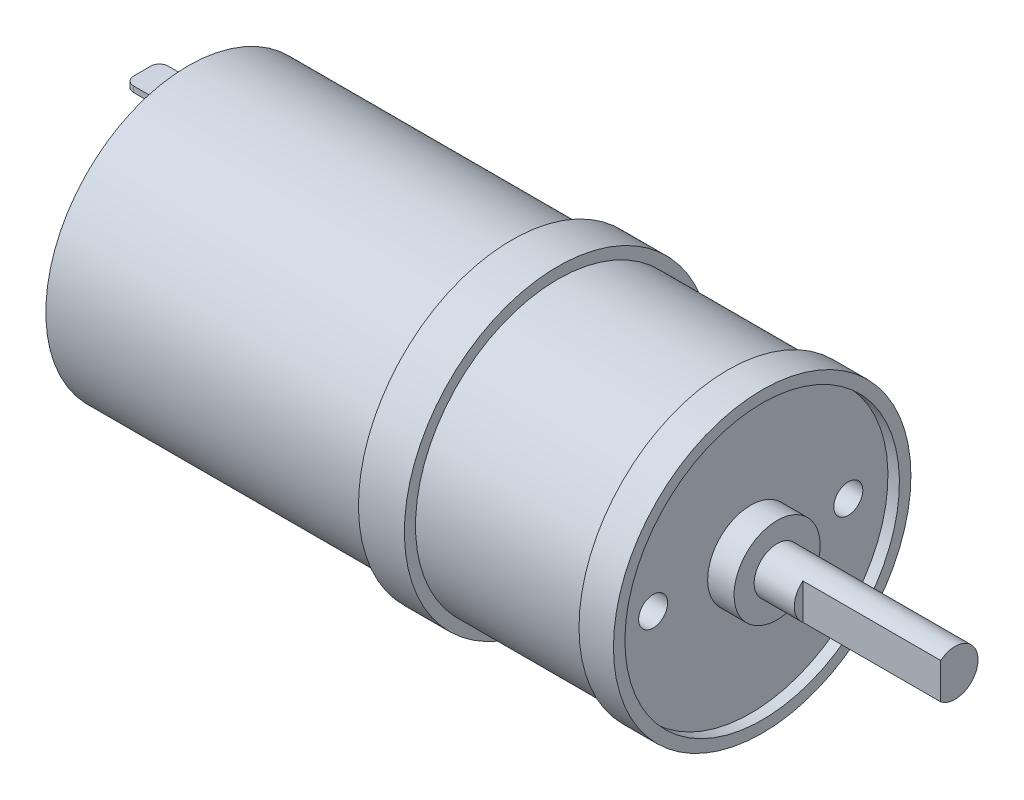
ISO-10303-21;
HEADER;
FILE_DESCRIPTION(('STEP AP214'),'2;1');
FILE_NAME('part.step','',(''),(''),'','','');
FILE_SCHEMA(('AUTOMOTIVE_DESIGN { 1 0 10303 214 1 1 1 1 }'));
ENDSEC;
DATA;
#1=APPLICATION_CONTEXT('core data for automotive mechanical design processes');
#2=APPLICATION_PROTOCOL_DEFINITION('international standard','automotive_design',2000,#1);
#3=PRODUCT_CONTEXT('',#1,'mechanical');
#4=PRODUCT('Part','Part','',(#3));
#5=PRODUCT_RELATED_PRODUCT_CATEGORY('part','',(#4));
#6=PRODUCT_DEFINITION_FORMATION('','',#4);
#7=PRODUCT_DEFINITION_CONTEXT('part definition',#1,'design');
#8=PRODUCT_DEFINITION('design','',#6,#7);
#9=PRODUCT_DEFINITION_SHAPE('','',#8);
#10=(LENGTH_UNIT() NAMED_UNIT(*) SI_UNIT(.MILLI.,.METRE.));
#11=(NAMED_UNIT(*) PLANE_ANGLE_UNIT() SI_UNIT($,.RADIAN.));
#12=(NAMED_UNIT(*) SI_UNIT($,.STERADIAN.) SOLID_ANGLE_UNIT());
#13=UNCERTAINTY_MEASURE_WITH_UNIT(LENGTH_MEASURE(1.E-05),#10,'distance_accuracy_value','');
#14=(GEOMETRIC_REPRESENTATION_CONTEXT(3) GLOBAL_UNCERTAINTY_ASSIGNED_CONTEXT((#13)) GLOBAL_UNIT_ASSIGNED_CONTEXT((#10,
#11,#12)) REPRESENTATION_CONTEXT('',''));
#15=CARTESIAN_POINT('',(0.,0.,0.));
#16=DIRECTION('',(0.,0.,1.));
#17=DIRECTION('',(1.,0.,0.));
#18=AXIS2_PLACEMENT_3D('',#15,#16,#17);
#19=CARTESIAN_POINT('',(118.068,12.7,19.151));
#20=DIRECTION('',(1.,0.,0.));
#21=DIRECTION('',(0.,1.,0.));
#22=AXIS2_PLACEMENT_3D('',#19,#20,#21);
#23=PLANE('',#22);
#24=CARTESIAN_POINT('',(118.068,12.7,17.526));
#25=DIRECTION('',(1.,0.,0.));
#26=DIRECTION('',(0.,1.,0.));
#27=AXIS2_PLACEMENT_3D('',#24,#25,#26);
#28=CIRCLE('',#27,2.);
#29=CARTESIAN_POINT('',(118.068,11.1387505004004,18.776));
#30=VERTEX_POINT('',#29);
#31=CARTESIAN_POINT('',(118.068,14.2612494995996,18.776));
#32=VERTEX_POINT('',#31);
#33=EDGE_CURVE('E172',#30,#32,#28,.F.);
#34=ORIENTED_EDGE('',*,*,#33,.F.);
#35=DIRECTION('',(0.,1.,0.));
#36=VECTOR('',#35,1.);
#37=CARTESIAN_POINT('',(118.068,14.2612494995996,18.776));
#38=LINE('',#37,#36);
#39=EDGE_CURVE('E75',#30,#32,#38,.T.);
#40=ORIENTED_EDGE('',*,*,#39,.T.);
#41=EDGE_LOOP('',(#34,#40));
#42=FACE_BOUND('',#41,.T.);
#43=ADVANCED_FACE('F49',(#42),#23,.T.);
#44=CARTESIAN_POINT('',(130.068,14.2612494995996,18.776));
#45=DIRECTION('',(0.,0.,-1.));
#46=DIRECTION('',(0.,1.,0.));
#47=AXIS2_PLACEMENT_3D('',#44,#45,#46);
#48=PLANE('',#47);
#49=DIRECTION('',(1.,0.,0.));
#50=VECTOR('',#49,1.);
#51=CARTESIAN_POINT('',(112.268,14.2612494995996,18.776));
#52=LINE('',#51,#50);
#53=CARTESIAN_POINT('',(130.068,14.2612494995996,18.776));
#54=VERTEX_POINT('',#53);
#55=EDGE_CURVE('E170',#32,#54,#52,.T.);
#56=ORIENTED_EDGE('',*,*,#55,.F.);
#57=ORIENTED_EDGE('',*,*,#39,.F.);
#58=DIRECTION('',(1.,0.,0.));
#59=VECTOR('',#58,1.);
#60=CARTESIAN_POINT('',(112.268,11.1387505004004,18.776));
#61=LINE('',#60,#59);
#62=CARTESIAN_POINT('',(130.068,11.1387505004004,18.776));
#63=VERTEX_POINT('',#62);
#64=EDGE_CURVE('E169',#63,#30,#61,.F.);
#65=ORIENTED_EDGE('',*,*,#64,.F.);
#66=DIRECTION('',(0.,1.,0.));
#67=VECTOR('',#66,1.);
#68=CARTESIAN_POINT('',(130.068,12.7,18.776));
#69=LINE('',#68,#67);
#70=EDGE_CURVE('E167',#54,#63,#69,.F.);
#71=ORIENTED_EDGE('',*,*,#70,.F.);
#72=EDGE_LOOP('',(#56,#57,#65,#71));
#73=FACE_BOUND('',#72,.T.);
#74=ADVANCED_FACE('F179',(#73),#48,.F.);
#75=CARTESIAN_POINT('',(130.068,12.7,17.526));
#76=DIRECTION('',(1.,0.,0.));
#77=DIRECTION('',(0.,1.,0.));
#78=AXIS2_PLACEMENT_3D('',#75,#76,#77);
#79=PLANE('',#78);
#80=CARTESIAN_POINT('',(130.068,12.7,17.526));
#81=DIRECTION('',(1.,0.,0.));
#82=DIRECTION('',(0.,1.,0.));
#83=AXIS2_PLACEMENT_3D('',#80,#81,#82);
#84=CIRCLE('',#83,2.);
#85=EDGE_CURVE('E57',#54,#63,#84,.F.);
#86=ORIENTED_EDGE('',*,*,#85,.F.);
#87=ORIENTED_EDGE('',*,*,#70,.T.);
#88=EDGE_LOOP('',(#86,#87));
#89=FACE_BOUND('',#88,.T.);
#90=ADVANCED_FACE('F180',(#89),#79,.T.);
#91=CARTESIAN_POINT('',(112.268,12.7,17.526));
#92=DIRECTION('',(1.,0.,0.));
#93=DIRECTION('',(0.,1.,0.));
#94=AXIS2_PLACEMENT_3D('',#91,#92,#93);
#95=CYLINDRICAL_SURFACE('',#94,2.);
#96=CARTESIAN_POINT('',(114.568,12.7,17.526));
#97=DIRECTION('',(1.,0.,0.));
#98=DIRECTION('',(0.,1.,0.));
#99=AXIS2_PLACEMENT_3D('',#96,#97,#98);
#100=CIRCLE('',#99,2.);
#101=CARTESIAN_POINT('',(114.568,14.7,17.526));
#102=VERTEX_POINT('',#101);
#103=EDGE_CURVE('E12',#102,#102,#100,.F.);
#104=ORIENTED_EDGE('',*,*,#103,.F.);
#105=EDGE_LOOP('',(#104));
#106=FACE_BOUND('',#105,.T.);
#107=ORIENTED_EDGE('',*,*,#55,.T.);
#108=ORIENTED_EDGE('',*,*,#85,.T.);
#109=ORIENTED_EDGE('',*,*,#64,.T.);
#110=ORIENTED_EDGE('',*,*,#33,.T.);
#111=EDGE_LOOP('',(#107,#108,#109,#110));
#112=FACE_BOUND('',#111,.T.);
#113=ADVANCED_FACE('F177',(#106,#112),#95,.T.);
#114=CARTESIAN_POINT('',(63.268,2.70000000000003,16.026));
#115=DIRECTION('',(0.,-1.,0.));
#116=DIRECTION('',(1.,0.,0.));
#117=AXIS2_PLACEMENT_3D('',#114,#115,#116);
#118=PLANE('',#117);
#119=CARTESIAN_POINT('',(60.018,2.70000000000004,18.276));
#120=DIRECTION('',(0.,1.,0.));
#121=DIRECTION('',(-1.,0.,0.));
#122=AXIS2_PLACEMENT_3D('',#119,#120,#121);
#123=CIRCLE('',#122,0.75);
#124=CARTESIAN_POINT('',(59.268,2.70000000000004,18.276));
#125=VERTEX_POINT('',#124);
#126=CARTESIAN_POINT('',(60.018,2.70000000000004,19.026));
#127=VERTEX_POINT('',#126);
#128=EDGE_CURVE('E165',#125,#127,#123,.T.);
#129=ORIENTED_EDGE('',*,*,#128,.F.);
#130=DIRECTION('',(0.,0.,1.));
#131=VECTOR('',#130,1.);
#132=CARTESIAN_POINT('',(59.268,2.70000000000004,17.526));
#133=LINE('',#132,#131);
#134=CARTESIAN_POINT('',(59.268,2.70000000000004,16.776));
#135=VERTEX_POINT('',#134);
#136=EDGE_CURVE('E124',#135,#125,#133,.T.);
#137=ORIENTED_EDGE('',*,*,#136,.F.);
#138=CARTESIAN_POINT('',(60.018,2.70000000000004,16.776));
#139=DIRECTION('',(0.,-1.,0.));
#140=DIRECTION('',(1.,0.,0.));
#141=AXIS2_PLACEMENT_3D('',#138,#139,#140);
#142=CIRCLE('',#141,0.749999999999999);
#143=CARTESIAN_POINT('',(60.018,2.70000000000003,16.026));
#144=VERTEX_POINT('',#143);
#145=EDGE_CURVE('E116',#144,#135,#142,.F.);
#146=ORIENTED_EDGE('',*,*,#145,.F.);
#147=DIRECTION('',(1.,0.,0.));
#148=VECTOR('',#147,1.);
#149=CARTESIAN_POINT('',(63.268,2.70000000000003,16.026));
#150=LINE('',#149,#148);
#151=CARTESIAN_POINT('',(63.268,2.70000000000003,16.026));
#152=VERTEX_POINT('',#151);
#153=EDGE_CURVE('E123',#152,#144,#150,.F.);
#154=ORIENTED_EDGE('',*,*,#153,.F.);
#155=DIRECTION('',(0.,0.,1.));
#156=VECTOR('',#155,1.);
#157=CARTESIAN_POINT('',(63.268,2.70000000000003,17.526));
#158=LINE('',#157,#156);
#159=CARTESIAN_POINT('',(63.268,2.70000000000003,19.026));
#160=VERTEX_POINT('',#159);
#161=EDGE_CURVE('E149',#152,#160,#158,.T.);
#162=ORIENTED_EDGE('',*,*,#161,.T.);
#163=DIRECTION('',(1.,0.,0.));
#164=VECTOR('',#163,1.);
#165=CARTESIAN_POINT('',(63.268,2.70000000000004,19.026));
#166=LINE('',#165,#164);
#167=EDGE_CURVE('E151',#127,#160,#166,.T.);
#168=ORIENTED_EDGE('',*,*,#167,.F.);
#169=EDGE_LOOP('',(#129,#137,#146,#154,#162,#168));
#170=FACE_BOUND('',#169,.T.);
#171=ADVANCED_FACE('F119',(#170),#118,.T.);
#172=CARTESIAN_POINT('',(60.018,3.07500000000003,16.776));
#173=DIRECTION('',(0.,-1.,0.));
#174=DIRECTION('',(1.,0.,0.));
#175=AXIS2_PLACEMENT_3D('',#172,#173,#174);
#176=CYLINDRICAL_SURFACE('',#175,0.749999999999999);
#177=CARTESIAN_POINT('',(60.018,3.20000000000004,16.776));
#178=DIRECTION('',(0.,-1.,0.));
#179=DIRECTION('',(1.,0.,0.));
#180=AXIS2_PLACEMENT_3D('',#177,#178,#179);
#181=CIRCLE('',#180,0.749999999999999);
#182=CARTESIAN_POINT('',(60.018,3.20000000000003,16.026));
#183=VERTEX_POINT('',#182);
#184=CARTESIAN_POINT('',(59.268,3.20000000000004,16.776));
#185=VERTEX_POINT('',#184);
#186=EDGE_CURVE('E134',#183,#185,#181,.F.);
#187=ORIENTED_EDGE('',*,*,#186,.F.);
#188=DIRECTION('',(0.,1.,0.));
#189=VECTOR('',#188,1.);
#190=CARTESIAN_POINT('',(60.018,3.20000000000003,16.026));
#191=LINE('',#190,#189);
#192=EDGE_CURVE('E131',#144,#183,#191,.T.);
#193=ORIENTED_EDGE('',*,*,#192,.F.);
#194=ORIENTED_EDGE('',*,*,#145,.T.);
#195=DIRECTION('',(0.,-1.,0.));
#196=VECTOR('',#195,1.);
#197=CARTESIAN_POINT('',(59.268,2.95000000000004,16.776));
#198=LINE('',#197,#196);
#199=EDGE_CURVE('E127',#185,#135,#198,.T.);
#200=ORIENTED_EDGE('',*,*,#199,.F.);
#201=EDGE_LOOP('',(#187,#193,#194,#200));
#202=FACE_BOUND('',#201,.T.);
#203=ADVANCED_FACE('F132',(#202),#176,.T.);
#204=CARTESIAN_POINT('',(59.268,2.95000000000004,17.526));
#205=DIRECTION('',(-1.,0.,0.));
#206=DIRECTION('',(0.,-1.,0.));
#207=AXIS2_PLACEMENT_3D('',#204,#205,#206);
#208=PLANE('',#207);
#209=DIRECTION('',(0.,1.,0.));
#210=VECTOR('',#209,1.);
#211=CARTESIAN_POINT('',(59.268,2.82500000000004,18.276));
#212=LINE('',#211,#210);
#213=CARTESIAN_POINT('',(59.268,3.20000000000004,18.276));
#214=VERTEX_POINT('',#213);
#215=EDGE_CURVE('E160',#214,#125,#212,.F.);
#216=ORIENTED_EDGE('',*,*,#215,.F.);
#217=DIRECTION('',(0.,0.,1.));
#218=VECTOR('',#217,1.);
#219=CARTESIAN_POINT('',(59.268,3.20000000000003,19.026));
#220=LINE('',#219,#218);
#221=EDGE_CURVE('E141',#185,#214,#220,.T.);
#222=ORIENTED_EDGE('',*,*,#221,.F.);
#223=ORIENTED_EDGE('',*,*,#199,.T.);
#224=ORIENTED_EDGE('',*,*,#136,.T.);
#225=EDGE_LOOP('',(#216,#222,#223,#224));
#226=FACE_BOUND('',#225,.T.);
#227=ADVANCED_FACE('F195',(#226),#208,.T.);
#228=CARTESIAN_POINT('',(60.018,2.82500000000003,18.276));
#229=DIRECTION('',(0.,1.,0.));
#230=DIRECTION('',(-1.,0.,0.));
#231=AXIS2_PLACEMENT_3D('',#228,#229,#230);
#232=CYLINDRICAL_SURFACE('',#231,0.75);
#233=ORIENTED_EDGE('',*,*,#128,.T.);
#234=DIRECTION('',(0.,-1.,0.));
#235=VECTOR('',#234,1.);
#236=CARTESIAN_POINT('',(60.018,2.70000000000003,19.026));
#237=LINE('',#236,#235);
#238=CARTESIAN_POINT('',(60.018,3.20000000000004,19.026));
#239=VERTEX_POINT('',#238);
#240=EDGE_CURVE('E156',#239,#127,#237,.T.);
#241=ORIENTED_EDGE('',*,*,#240,.F.);
#242=CARTESIAN_POINT('',(60.018,3.20000000000004,18.276));
#243=DIRECTION('',(0.,1.,0.));
#244=DIRECTION('',(-1.,0.,0.));
#245=AXIS2_PLACEMENT_3D('',#242,#243,#244);
#246=CIRCLE('',#245,0.75);
#247=EDGE_CURVE('E161',#214,#239,#246,.T.);
#248=ORIENTED_EDGE('',*,*,#247,.F.);
#249=ORIENTED_EDGE('',*,*,#215,.T.);
#250=EDGE_LOOP('',(#233,#241,#248,#249));
#251=FACE_BOUND('',#250,.T.);
#252=ADVANCED_FACE('F198',(#251),#232,.T.);
#253=CARTESIAN_POINT('',(63.268,2.70000000000003,19.026));
#254=DIRECTION('',(0.,0.,1.));
#255=DIRECTION('',(0.,-1.,0.));
#256=AXIS2_PLACEMENT_3D('',#253,#254,#255);
#257=PLANE('',#256);
#258=DIRECTION('',(0.,-1.,0.));
#259=VECTOR('',#258,1.);
#260=CARTESIAN_POINT('',(63.268,12.7,19.026));
#261=LINE('',#260,#259);
#262=CARTESIAN_POINT('',(63.268,3.20000000000003,19.026));
#263=VERTEX_POINT('',#262);
#264=EDGE_CURVE('E137',#160,#263,#261,.F.);
#265=ORIENTED_EDGE('',*,*,#264,.T.);
#266=DIRECTION('',(1.,0.,0.));
#267=VECTOR('',#266,1.);
#268=CARTESIAN_POINT('',(63.268,3.20000000000003,19.026));
#269=LINE('',#268,#267);
#270=EDGE_CURVE('E163',#239,#263,#269,.T.);
#271=ORIENTED_EDGE('',*,*,#270,.F.);
#272=ORIENTED_EDGE('',*,*,#240,.T.);
#273=ORIENTED_EDGE('',*,*,#167,.T.);
#274=EDGE_LOOP('',(#265,#271,#272,#273));
#275=FACE_BOUND('',#274,.T.);
#276=ADVANCED_FACE('F202',(#275),#257,.T.);
#277=CARTESIAN_POINT('',(63.268,3.20000000000003,16.026));
#278=DIRECTION('',(0.,0.,-1.));
#279=DIRECTION('',(0.,1.,0.));
#280=AXIS2_PLACEMENT_3D('',#277,#278,#279);
#281=PLANE('',#280);
#282=DIRECTION('',(0.,1.,0.));
#283=VECTOR('',#282,1.);
#284=CARTESIAN_POINT('',(63.268,3.20000000000003,16.026));
#285=LINE('',#284,#283);
#286=CARTESIAN_POINT('',(63.268,3.20000000000003,16.026));
#287=VERTEX_POINT('',#286);
#288=EDGE_CURVE('E88',#287,#152,#285,.F.);
#289=ORIENTED_EDGE('',*,*,#288,.T.);
#290=ORIENTED_EDGE('',*,*,#153,.T.);
#291=ORIENTED_EDGE('',*,*,#192,.T.);
#292=DIRECTION('',(1.,0.,0.));
#293=VECTOR('',#292,1.);
#294=CARTESIAN_POINT('',(63.268,3.20000000000003,16.026));
#295=LINE('',#294,#293);
#296=EDGE_CURVE('E174',#287,#183,#295,.F.);
#297=ORIENTED_EDGE('',*,*,#296,.F.);
#298=EDGE_LOOP('',(#289,#290,#291,#297));
#299=FACE_BOUND('',#298,.T.);
#300=ADVANCED_FACE('F139',(#299),#281,.T.);
#301=CARTESIAN_POINT('',(63.268,3.20000000000003,19.026));
#302=DIRECTION('',(0.,1.,0.));
#303=DIRECTION('',(0.,0.,1.));
#304=AXIS2_PLACEMENT_3D('',#301,#302,#303);
#305=PLANE('',#304);
#306=DIRECTION('',(0.,0.,1.));
#307=VECTOR('',#306,1.);
#308=CARTESIAN_POINT('',(63.268,3.20000000000003,19.026));
#309=LINE('',#308,#307);
#310=EDGE_CURVE('E260',#263,#287,#309,.F.);
#311=ORIENTED_EDGE('',*,*,#310,.T.);
#312=ORIENTED_EDGE('',*,*,#296,.T.);
#313=ORIENTED_EDGE('',*,*,#186,.T.);
#314=ORIENTED_EDGE('',*,*,#221,.T.);
#315=ORIENTED_EDGE('',*,*,#247,.T.);
#316=ORIENTED_EDGE('',*,*,#270,.T.);
#317=EDGE_LOOP('',(#311,#312,#313,#314,#315,#316));
#318=FACE_BOUND('',#317,.T.);
#319=ADVANCED_FACE('F209',(#318),#305,.T.);
#320=CARTESIAN_POINT('',(108.268,12.7,26.026));
#321=DIRECTION('',(-1.,0.,0.));
#322=DIRECTION('',(0.,-1.,0.));
#323=AXIS2_PLACEMENT_3D('',#320,#321,#322);
#324=PLANE('',#323);
#325=CARTESIAN_POINT('',(108.268,12.7,26.026));
#326=DIRECTION('',(-1.,0.,0.));
#327=DIRECTION('',(0.,-1.,0.));
#328=AXIS2_PLACEMENT_3D('',#325,#326,#327);
#329=CIRCLE('',#328,1.2645);
#330=CARTESIAN_POINT('',(108.268,11.4355,26.026));
#331=VERTEX_POINT('',#330);
#332=EDGE_CURVE('E422',#331,#331,#329,.F.);
#333=ORIENTED_EDGE('',*,*,#332,.T.);
#334=EDGE_LOOP('',(#333));
#335=FACE_BOUND('',#334,.T.);
#336=ADVANCED_FACE('F212',(#335),#324,.F.);
#337=CARTESIAN_POINT('',(108.268,12.7,9.02600000000002));
#338=DIRECTION('',(-1.,0.,0.));
#339=DIRECTION('',(0.,-1.,0.));
#340=AXIS2_PLACEMENT_3D('',#337,#338,#339);
#341=PLANE('',#340);
#342=CARTESIAN_POINT('',(108.268,12.7,9.02600000000002));
#343=DIRECTION('',(-1.,0.,0.));
#344=DIRECTION('',(0.,-1.,0.));
#345=AXIS2_PLACEMENT_3D('',#342,#343,#344);
#346=CIRCLE('',#345,1.2645);
#347=CARTESIAN_POINT('',(108.268,11.4355,9.02600000000002));
#348=VERTEX_POINT('',#347);
#349=EDGE_CURVE('E476',#348,#348,#346,.F.);
#350=ORIENTED_EDGE('',*,*,#349,.T.);
#351=EDGE_LOOP('',(#350));
#352=FACE_BOUND('',#351,.T.);
#353=ADVANCED_FACE('F216',(#352),#341,.F.);
#354=CARTESIAN_POINT('',(110.268,12.7,26.026));
#355=DIRECTION('',(-1.,0.,0.));
#356=DIRECTION('',(0.,-1.,0.));
#357=AXIS2_PLACEMENT_3D('',#354,#355,#356);
#358=CYLINDRICAL_SURFACE('',#357,1.2645);
#359=CARTESIAN_POINT('',(112.268,12.7,26.026));
#360=DIRECTION('',(-1.,0.,0.));
#361=DIRECTION('',(0.,-1.,0.));
#362=AXIS2_PLACEMENT_3D('',#359,#360,#361);
#363=CIRCLE('',#362,1.2645);
#364=CARTESIAN_POINT('',(112.268,11.4355,26.026));
#365=VERTEX_POINT('',#364);
#366=EDGE_CURVE('E471',#365,#365,#363,.T.);
#367=ORIENTED_EDGE('',*,*,#366,.F.);
#368=EDGE_LOOP('',(#367));
#369=FACE_BOUND('',#368,.T.);
#370=ORIENTED_EDGE('',*,*,#332,.F.);
#371=EDGE_LOOP('',(#370));
#372=FACE_BOUND('',#371,.T.);
#373=ADVANCED_FACE('F221',(#369,#372),#358,.F.);
#374=CARTESIAN_POINT('',(110.268,12.7,9.02600000000002));
#375=DIRECTION('',(-1.,0.,0.));
#376=DIRECTION('',(0.,-1.,0.));
#377=AXIS2_PLACEMENT_3D('',#374,#375,#376);
#378=CYLINDRICAL_SURFACE('',#377,1.2645);
#379=CARTESIAN_POINT('',(112.268,12.7,9.02600000000002));
#380=DIRECTION('',(-1.,0.,0.));
#381=DIRECTION('',(0.,-1.,0.));
#382=AXIS2_PLACEMENT_3D('',#379,#380,#381);
#383=CIRCLE('',#382,1.2645);
#384=CARTESIAN_POINT('',(112.268,11.4355,9.02600000000002));
#385=VERTEX_POINT('',#384);
#386=EDGE_CURVE('E469',#385,#385,#383,.T.);
#387=ORIENTED_EDGE('',*,*,#386,.F.);
#388=EDGE_LOOP('',(#387));
#389=FACE_BOUND('',#388,.T.);
#390=ORIENTED_EDGE('',*,*,#349,.F.);
#391=EDGE_LOOP('',(#390));
#392=FACE_BOUND('',#391,.T.);
#393=ADVANCED_FACE('F225',(#389,#392),#378,.F.);
#394=CARTESIAN_POINT('',(93.468,12.7,17.526));
#395=DIRECTION('',(1.,0.,0.));
#396=DIRECTION('',(0.,1.,0.));
#397=AXIS2_PLACEMENT_3D('',#394,#395,#396);
#398=PLANE('',#397);
#399=CARTESIAN_POINT('',(93.468,12.7,17.526));
#400=DIRECTION('',(-1.,0.,0.));
#401=DIRECTION('',(0.,-1.,0.));
#402=AXIS2_PLACEMENT_3D('',#399,#400,#401);
#403=CIRCLE('',#402,11.4);
#404=CARTESIAN_POINT('',(93.468,1.30000000000002,17.526));
#405=VERTEX_POINT('',#404);
#406=EDGE_CURVE('E425',#405,#405,#403,.T.);
#407=ORIENTED_EDGE('',*,*,#406,.F.);
#408=EDGE_LOOP('',(#407));
#409=FACE_BOUND('',#408,.T.);
#410=CARTESIAN_POINT('',(93.468,12.7,17.526));
#411=DIRECTION('',(1.,0.,0.));
#412=DIRECTION('',(0.,-1.,0.));
#413=AXIS2_PLACEMENT_3D('',#410,#411,#412);
#414=CIRCLE('',#413,12.3);
#415=CARTESIAN_POINT('',(93.468,0.400000000000018,17.526));
#416=VERTEX_POINT('',#415);
#417=EDGE_CURVE('E467',#416,#416,#414,.T.);
#418=ORIENTED_EDGE('',*,*,#417,.F.);
#419=EDGE_LOOP('',(#418));
#420=FACE_BOUND('',#419,.T.);
#421=ADVANCED_FACE('F229',(#409,#420),#398,.F.);
#422=CARTESIAN_POINT('',(112.268,12.7,17.526));
#423=DIRECTION('',(1.,0.,0.));
#424=DIRECTION('',(0.,1.,0.));
#425=AXIS2_PLACEMENT_3D('',#422,#423,#424);
#426=PLANE('',#425);
#427=CARTESIAN_POINT('',(112.268,12.7,17.526));
#428=DIRECTION('',(1.,0.,0.));
#429=DIRECTION('',(0.,1.,0.));
#430=AXIS2_PLACEMENT_3D('',#427,#428,#429);
#431=CIRCLE('',#430,3.75);
#432=CARTESIAN_POINT('',(112.268,16.45,17.526));
#433=VERTEX_POINT('',#432);
#434=EDGE_CURVE('E128',#433,#433,#431,.T.);
#435=ORIENTED_EDGE('',*,*,#434,.F.);
#436=EDGE_LOOP('',(#435));
#437=FACE_BOUND('',#436,.T.);
#438=CARTESIAN_POINT('',(112.268,12.7,17.526));
#439=DIRECTION('',(-1.,0.,0.));
#440=DIRECTION('',(0.,-1.,0.));
#441=AXIS2_PLACEMENT_3D('',#438,#439,#440);
#442=CIRCLE('',#441,12.3);
#443=CARTESIAN_POINT('',(112.268,0.400000000000008,17.526));
#444=VERTEX_POINT('',#443);
#445=EDGE_CURVE('E440',#444,#444,#442,.T.);
#446=ORIENTED_EDGE('',*,*,#445,.F.);
#447=EDGE_LOOP('',(#446));
#448=FACE_BOUND('',#447,.T.);
#449=ORIENTED_EDGE('',*,*,#386,.T.);
#450=EDGE_LOOP('',(#449));
#451=FACE_BOUND('',#450,.T.);
#452=ORIENTED_EDGE('',*,*,#366,.T.);
#453=EDGE_LOOP('',(#452));
#454=FACE_BOUND('',#453,.T.);
#455=ADVANCED_FACE('F234',(#437,#448,#451,#454),#426,.T.);
#456=CARTESIAN_POINT('',(93.568,12.7,17.526));
#457=DIRECTION('',(1.,0.,0.));
#458=DIRECTION('',(0.,1.,0.));
#459=AXIS2_PLACEMENT_3D('',#456,#457,#458);
#460=TOROIDAL_SURFACE('',#459,12.3,0.1);
#461=CARTESIAN_POINT('',(93.568,12.7,17.526));
#462=DIRECTION('',(1.,0.,0.));
#463=DIRECTION('',(0.,1.,0.));
#464=AXIS2_PLACEMENT_3D('',#461,#462,#463);
#465=CIRCLE('',#464,12.4);
#466=CARTESIAN_POINT('',(93.568,25.1,17.526));
#467=VERTEX_POINT('',#466);
#468=EDGE_CURVE('E437',#467,#467,#465,.T.);
#469=ORIENTED_EDGE('',*,*,#468,.F.);
#470=EDGE_LOOP('',(#469));
#471=FACE_BOUND('',#470,.T.);
#472=ORIENTED_EDGE('',*,*,#417,.T.);
#473=EDGE_LOOP('',(#472));
#474=FACE_BOUND('',#473,.T.);
#475=ADVANCED_FACE('F450',(#471,#474),#460,.T.);
#476=CARTESIAN_POINT('',(112.168,12.7,17.526));
#477=DIRECTION('',(1.,0.,0.));
#478=DIRECTION('',(0.,1.,0.));
#479=AXIS2_PLACEMENT_3D('',#476,#477,#478);
#480=TOROIDAL_SURFACE('',#479,12.3,0.1);
#481=ORIENTED_EDGE('',*,*,#445,.T.);
#482=EDGE_LOOP('',(#481));
#483=FACE_BOUND('',#482,.T.);
#484=CARTESIAN_POINT('',(112.168,12.7,17.526));
#485=DIRECTION('',(1.,0.,0.));
#486=DIRECTION('',(0.,1.,0.));
#487=AXIS2_PLACEMENT_3D('',#484,#485,#486);
#488=CIRCLE('',#487,12.4);
#489=CARTESIAN_POINT('',(112.168,25.1,17.526));
#490=VERTEX_POINT('',#489);
#491=EDGE_CURVE('E258',#490,#490,#488,.F.);
#492=ORIENTED_EDGE('',*,*,#491,.F.);
#493=EDGE_LOOP('',(#492));
#494=FACE_BOUND('',#493,.T.);
#495=ADVANCED_FACE('F446',(#483,#494),#480,.T.);
#496=CARTESIAN_POINT('',(93.468,12.7,17.526));
#497=DIRECTION('',(1.,0.,0.));
#498=DIRECTION('',(0.,1.,0.));
#499=AXIS2_PLACEMENT_3D('',#496,#497,#498);
#500=CYLINDRICAL_SURFACE('',#499,12.4);
#501=ORIENTED_EDGE('',*,*,#468,.T.);
#502=EDGE_LOOP('',(#501));
#503=FACE_BOUND('',#502,.T.);
#504=ORIENTED_EDGE('',*,*,#491,.T.);
#505=EDGE_LOOP('',(#504));
#506=FACE_BOUND('',#505,.T.);
#507=ADVANCED_FACE('F192',(#503,#506),#500,.T.);
#508=CARTESIAN_POINT('',(61.268,12.7,17.526));
#509=DIRECTION('',(1.,0.,0.));
#510=DIRECTION('',(0.,1.,0.));
#511=AXIS2_PLACEMENT_3D('',#508,#509,#510);
#512=PLANE('',#511);
#513=CARTESIAN_POINT('',(61.268,12.7,17.526));
#514=DIRECTION('',(1.,0.,0.));
#515=DIRECTION('',(0.,1.,0.));
#516=AXIS2_PLACEMENT_3D('',#513,#514,#515);
#517=CIRCLE('',#516,4.);
#518=CARTESIAN_POINT('',(61.268,16.7,17.526));
#519=VERTEX_POINT('',#518);
#520=EDGE_CURVE('E426',#519,#519,#517,.F.);
#521=ORIENTED_EDGE('',*,*,#520,.T.);
#522=EDGE_LOOP('',(#521));
#523=FACE_BOUND('',#522,.T.);
#524=ADVANCED_FACE('F515',(#523),#512,.F.);
#525=CARTESIAN_POINT('',(61.268,12.7,17.526));
#526=DIRECTION('',(1.,0.,0.));
#527=DIRECTION('',(0.,1.,0.));
#528=AXIS2_PLACEMENT_3D('',#525,#526,#527);
#529=CYLINDRICAL_SURFACE('',#528,4.);
#530=ORIENTED_EDGE('',*,*,#520,.F.);
#531=EDGE_LOOP('',(#530));
#532=FACE_BOUND('',#531,.T.);
#533=CARTESIAN_POINT('',(63.268,12.7,17.526));
#534=DIRECTION('',(1.,0.,0.));
#535=DIRECTION('',(0.,1.,0.));
#536=AXIS2_PLACEMENT_3D('',#533,#534,#535);
#537=CIRCLE('',#536,4.);
#538=CARTESIAN_POINT('',(63.268,16.7,17.526));
#539=VERTEX_POINT('',#538);
#540=EDGE_CURVE('E397',#539,#539,#537,.T.);
#541=ORIENTED_EDGE('',*,*,#540,.F.);
#542=EDGE_LOOP('',(#541));
#543=FACE_BOUND('',#542,.T.);
#544=ADVANCED_FACE('F408',(#532,#543),#529,.T.);
#545=CARTESIAN_POINT('',(92.468,12.7,17.526));
#546=DIRECTION('',(1.,0.,0.));
#547=DIRECTION('',(0.,1.,0.));
#548=AXIS2_PLACEMENT_3D('',#545,#546,#547);
#549=TOROIDAL_SURFACE('',#548,11.4,0.999999999999999);
#550=ORIENTED_EDGE('',*,*,#406,.T.);
#551=EDGE_LOOP('',(#550));
#552=FACE_BOUND('',#551,.T.);
#553=CARTESIAN_POINT('',(92.468,12.7,17.526));
#554=DIRECTION('',(-1.,0.,0.));
#555=DIRECTION('',(0.,-1.,0.));
#556=AXIS2_PLACEMENT_3D('',#553,#554,#555);
#557=CIRCLE('',#556,12.4);
#558=CARTESIAN_POINT('',(92.468,0.300000000000019,17.526));
#559=VERTEX_POINT('',#558);
#560=EDGE_CURVE('E393',#559,#559,#557,.T.);
#561=ORIENTED_EDGE('',*,*,#560,.F.);
#562=EDGE_LOOP('',(#561));
#563=FACE_BOUND('',#562,.T.);
#564=ADVANCED_FACE('F403',(#552,#563),#549,.T.);
#565=CARTESIAN_POINT('',(63.268,12.7,17.526));
#566=DIRECTION('',(-1.,0.,0.));
#567=DIRECTION('',(0.,-1.,0.));
#568=AXIS2_PLACEMENT_3D('',#565,#566,#567);
#569=PLANE('',#568);
#570=ORIENTED_EDGE('',*,*,#264,.F.);
#571=ORIENTED_EDGE('',*,*,#161,.F.);
#572=ORIENTED_EDGE('',*,*,#288,.F.);
#573=ORIENTED_EDGE('',*,*,#310,.F.);
#574=EDGE_LOOP('',(#570,#571,#572,#573));
#575=FACE_BOUND('',#574,.T.);
#576=DIRECTION('',(0.,0.,1.));
#577=VECTOR('',#576,1.);
#578=CARTESIAN_POINT('',(63.268,22.2,17.526));
#579=LINE('',#578,#577);
#580=CARTESIAN_POINT('',(63.268,22.2,16.026));
#581=VERTEX_POINT('',#580);
#582=CARTESIAN_POINT('',(63.268,22.2,19.026));
#583=VERTEX_POINT('',#582);
#584=EDGE_CURVE('E334',#581,#583,#579,.T.);
#585=ORIENTED_EDGE('',*,*,#584,.F.);
#586=DIRECTION('',(0.,1.,0.));
#587=VECTOR('',#586,1.);
#588=CARTESIAN_POINT('',(63.268,22.7,16.026));
#589=LINE('',#588,#587);
#590=CARTESIAN_POINT('',(63.268,22.7,16.026));
#591=VERTEX_POINT('',#590);
#592=EDGE_CURVE('E327',#591,#581,#589,.F.);
#593=ORIENTED_EDGE('',*,*,#592,.F.);
#594=DIRECTION('',(0.,0.,1.));
#595=VECTOR('',#594,1.);
#596=CARTESIAN_POINT('',(63.268,22.7,19.026));
#597=LINE('',#596,#595);
#598=CARTESIAN_POINT('',(63.268,22.7,19.026));
#599=VERTEX_POINT('',#598);
#600=EDGE_CURVE('E331',#599,#591,#597,.F.);
#601=ORIENTED_EDGE('',*,*,#600,.F.);
#602=DIRECTION('',(0.,-1.,0.));
#603=VECTOR('',#602,1.);
#604=CARTESIAN_POINT('',(63.268,12.7,19.026));
#605=LINE('',#604,#603);
#606=EDGE_CURVE('E339',#583,#599,#605,.F.);
#607=ORIENTED_EDGE('',*,*,#606,.F.);
#608=EDGE_LOOP('',(#585,#593,#601,#607));
#609=FACE_BOUND('',#608,.T.);
#610=CARTESIAN_POINT('',(63.268,12.7,17.526));
#611=DIRECTION('',(-1.,0.,0.));
#612=DIRECTION('',(0.,-1.,0.));
#613=AXIS2_PLACEMENT_3D('',#610,#611,#612);
#614=CIRCLE('',#613,12.4);
#615=CARTESIAN_POINT('',(63.268,0.300000000000033,17.526));
#616=VERTEX_POINT('',#615);
#617=EDGE_CURVE('E396',#616,#616,#614,.F.);
#618=ORIENTED_EDGE('',*,*,#617,.F.);
#619=EDGE_LOOP('',(#618));
#620=FACE_BOUND('',#619,.T.);
#621=ORIENTED_EDGE('',*,*,#540,.T.);
#622=EDGE_LOOP('',(#621));
#623=FACE_BOUND('',#622,.T.);
#624=ADVANCED_FACE('F287',(#575,#609,#620,#623),#569,.T.);
#625=CARTESIAN_POINT('',(93.468,12.7,17.526));
#626=DIRECTION('',(-1.,0.,0.));
#627=DIRECTION('',(0.,-1.,0.));
#628=AXIS2_PLACEMENT_3D('',#625,#626,#627);
#629=CYLINDRICAL_SURFACE('',#628,12.4);
#630=ORIENTED_EDGE('',*,*,#560,.T.);
#631=EDGE_LOOP('',(#630));
#632=FACE_BOUND('',#631,.T.);
#633=ORIENTED_EDGE('',*,*,#617,.T.);
#634=EDGE_LOOP('',(#633));
#635=FACE_BOUND('',#634,.T.);
#636=ADVANCED_FACE('F218',(#632,#635),#629,.T.);
#637=CARTESIAN_POINT('',(63.268,22.2,16.026));
#638=DIRECTION('',(0.,-1.,0.));
#639=DIRECTION('',(1.,0.,0.));
#640=AXIS2_PLACEMENT_3D('',#637,#638,#639);
#641=PLANE('',#640);
#642=ORIENTED_EDGE('',*,*,#584,.T.);
#643=DIRECTION('',(1.,0.,0.));
#644=VECTOR('',#643,1.);
#645=CARTESIAN_POINT('',(63.268,22.2,19.026));
#646=LINE('',#645,#644);
#647=CARTESIAN_POINT('',(60.0180000000001,22.2,19.026));
#648=VERTEX_POINT('',#647);
#649=EDGE_CURVE('E370',#648,#583,#646,.T.);
#650=ORIENTED_EDGE('',*,*,#649,.F.);
#651=CARTESIAN_POINT('',(60.0180000000001,22.2,18.276));
#652=DIRECTION('',(0.,1.,0.));
#653=DIRECTION('',(-1.,0.,0.));
#654=AXIS2_PLACEMENT_3D('',#651,#652,#653);
#655=CIRCLE('',#654,0.75);
#656=CARTESIAN_POINT('',(59.268,22.2,18.276));
#657=VERTEX_POINT('',#656);
#658=EDGE_CURVE('E371',#657,#648,#655,.T.);
#659=ORIENTED_EDGE('',*,*,#658,.F.);
#660=DIRECTION('',(0.,0.,1.));
#661=VECTOR('',#660,1.);
#662=CARTESIAN_POINT('',(59.268,22.2,16.026));
#663=LINE('',#662,#661);
#664=CARTESIAN_POINT('',(59.268,22.2,16.776));
#665=VERTEX_POINT('',#664);
#666=EDGE_CURVE('E375',#657,#665,#663,.F.);
#667=ORIENTED_EDGE('',*,*,#666,.T.);
#668=CARTESIAN_POINT('',(60.0180000000001,22.2,16.776));
#669=DIRECTION('',(0.,-1.,0.));
#670=DIRECTION('',(1.,0.,0.));
#671=AXIS2_PLACEMENT_3D('',#668,#669,#670);
#672=CIRCLE('',#671,0.749999999999999);
#673=CARTESIAN_POINT('',(60.0180000000001,22.2,16.026));
#674=VERTEX_POINT('',#673);
#675=EDGE_CURVE('E378',#665,#674,#672,.T.);
#676=ORIENTED_EDGE('',*,*,#675,.T.);
#677=DIRECTION('',(1.,0.,0.));
#678=VECTOR('',#677,1.);
#679=CARTESIAN_POINT('',(63.268,22.2,16.026));
#680=LINE('',#679,#678);
#681=EDGE_CURVE('E338',#581,#674,#680,.F.);
#682=ORIENTED_EDGE('',*,*,#681,.F.);
#683=EDGE_LOOP('',(#642,#650,#659,#667,#676,#682));
#684=FACE_BOUND('',#683,.T.);
#685=ADVANCED_FACE('F554',(#684),#641,.T.);
#686=CARTESIAN_POINT('',(60.0180000000001,22.325,18.276));
#687=DIRECTION('',(0.,1.,0.));
#688=DIRECTION('',(-1.,0.,0.));
#689=AXIS2_PLACEMENT_3D('',#686,#687,#688);
#690=CYLINDRICAL_SURFACE('',#689,0.75);
#691=ORIENTED_EDGE('',*,*,#658,.T.);
#692=DIRECTION('',(0.,-1.,0.));
#693=VECTOR('',#692,1.);
#694=CARTESIAN_POINT('',(60.0180000000001,22.2,19.026));
#695=LINE('',#694,#693);
#696=CARTESIAN_POINT('',(60.0180000000001,22.7,19.026));
#697=VERTEX_POINT('',#696);
#698=EDGE_CURVE('E367',#697,#648,#695,.T.);
#699=ORIENTED_EDGE('',*,*,#698,.F.);
#700=CARTESIAN_POINT('',(60.0180000000001,22.7,18.276));
#701=DIRECTION('',(0.,1.,0.));
#702=DIRECTION('',(-1.,0.,0.));
#703=AXIS2_PLACEMENT_3D('',#700,#701,#702);
#704=CIRCLE('',#703,0.75);
#705=CARTESIAN_POINT('',(59.268,22.7,18.276));
#706=VERTEX_POINT('',#705);
#707=EDGE_CURVE('E357',#706,#697,#704,.T.);
#708=ORIENTED_EDGE('',*,*,#707,.F.);
#709=DIRECTION('',(0.,-1.,0.));
#710=VECTOR('',#709,1.);
#711=CARTESIAN_POINT('',(59.268,22.45,18.276));
#712=LINE('',#711,#710);
#713=EDGE_CURVE('E853',#657,#706,#712,.F.);
#714=ORIENTED_EDGE('',*,*,#713,.F.);
#715=EDGE_LOOP('',(#691,#699,#708,#714));
#716=FACE_BOUND('',#715,.T.);
#717=ADVANCED_FACE('F550',(#716),#690,.T.);
#718=CARTESIAN_POINT('',(63.268,22.2,19.026));
#719=DIRECTION('',(0.,0.,1.));
#720=DIRECTION('',(0.,-1.,0.));
#721=AXIS2_PLACEMENT_3D('',#718,#719,#720);
#722=PLANE('',#721);
#723=ORIENTED_EDGE('',*,*,#606,.T.);
#724=DIRECTION('',(1.,0.,0.));
#725=VECTOR('',#724,1.);
#726=CARTESIAN_POINT('',(63.268,22.7,19.026));
#727=LINE('',#726,#725);
#728=EDGE_CURVE('E355',#697,#599,#727,.T.);
#729=ORIENTED_EDGE('',*,*,#728,.F.);
#730=ORIENTED_EDGE('',*,*,#698,.T.);
#731=ORIENTED_EDGE('',*,*,#649,.T.);
#732=EDGE_LOOP('',(#723,#729,#730,#731));
#733=FACE_BOUND('',#732,.T.);
#734=ADVANCED_FACE('F547',(#733),#722,.T.);
#735=CARTESIAN_POINT('',(63.268,22.7,16.026));
#736=DIRECTION('',(0.,0.,-1.));
#737=DIRECTION('',(0.,1.,0.));
#738=AXIS2_PLACEMENT_3D('',#735,#736,#737);
#739=PLANE('',#738);
#740=ORIENTED_EDGE('',*,*,#592,.T.);
#741=ORIENTED_EDGE('',*,*,#681,.T.);
#742=DIRECTION('',(0.,-1.,0.));
#743=VECTOR('',#742,1.);
#744=CARTESIAN_POINT('',(60.0180000000001,22.575,16.026));
#745=LINE('',#744,#743);
#746=CARTESIAN_POINT('',(60.0180000000001,22.7,16.026));
#747=VERTEX_POINT('',#746);
#748=EDGE_CURVE('E345',#747,#674,#745,.T.);
#749=ORIENTED_EDGE('',*,*,#748,.F.);
#750=DIRECTION('',(1.,0.,0.));
#751=VECTOR('',#750,1.);
#752=CARTESIAN_POINT('',(63.268,22.7,16.026));
#753=LINE('',#752,#751);
#754=EDGE_CURVE('E342',#591,#747,#753,.F.);
#755=ORIENTED_EDGE('',*,*,#754,.F.);
#756=EDGE_LOOP('',(#740,#741,#749,#755));
#757=FACE_BOUND('',#756,.T.);
#758=ADVANCED_FACE('F343',(#757),#739,.T.);
#759=CARTESIAN_POINT('',(60.0180000000001,22.575,16.776));
#760=DIRECTION('',(0.,-1.,0.));
#761=DIRECTION('',(1.,0.,0.));
#762=AXIS2_PLACEMENT_3D('',#759,#760,#761);
#763=CYLINDRICAL_SURFACE('',#762,0.749999999999999);
#764=CARTESIAN_POINT('',(60.0180000000001,22.7,16.776));
#765=DIRECTION('',(0.,-1.,0.));
#766=DIRECTION('',(1.,0.,0.));
#767=AXIS2_PLACEMENT_3D('',#764,#765,#766);
#768=CIRCLE('',#767,0.749999999999999);
#769=CARTESIAN_POINT('',(59.268,22.7,16.776));
#770=VERTEX_POINT('',#769);
#771=EDGE_CURVE('E349',#747,#770,#768,.F.);
#772=ORIENTED_EDGE('',*,*,#771,.F.);
#773=ORIENTED_EDGE('',*,*,#748,.T.);
#774=ORIENTED_EDGE('',*,*,#675,.F.);
#775=DIRECTION('',(0.,-1.,0.));
#776=VECTOR('',#775,1.);
#777=CARTESIAN_POINT('',(59.268,22.45,16.776));
#778=LINE('',#777,#776);
#779=EDGE_CURVE('E390',#770,#665,#778,.T.);
#780=ORIENTED_EDGE('',*,*,#779,.F.);
#781=EDGE_LOOP('',(#772,#773,#774,#780));
#782=FACE_BOUND('',#781,.T.);
#783=ADVANCED_FACE('F537',(#782),#763,.T.);
#784=CARTESIAN_POINT('',(59.268,22.45,17.526));
#785=DIRECTION('',(-1.,0.,0.));
#786=DIRECTION('',(0.,-1.,0.));
#787=AXIS2_PLACEMENT_3D('',#784,#785,#786);
#788=PLANE('',#787);
#789=ORIENTED_EDGE('',*,*,#779,.T.);
#790=ORIENTED_EDGE('',*,*,#666,.F.);
#791=ORIENTED_EDGE('',*,*,#713,.T.);
#792=DIRECTION('',(0.,0.,1.));
#793=VECTOR('',#792,1.);
#794=CARTESIAN_POINT('',(59.268,22.7,19.026));
#795=LINE('',#794,#793);
#796=EDGE_CURVE('E388',#770,#706,#795,.T.);
#797=ORIENTED_EDGE('',*,*,#796,.F.);
#798=EDGE_LOOP('',(#789,#790,#791,#797));
#799=FACE_BOUND('',#798,.T.);
#800=ADVANCED_FACE('F528',(#799),#788,.T.);
#801=CARTESIAN_POINT('',(63.268,22.7,19.026));
#802=DIRECTION('',(0.,1.,0.));
#803=DIRECTION('',(0.,0.,1.));
#804=AXIS2_PLACEMENT_3D('',#801,#802,#803);
#805=PLANE('',#804);
#806=ORIENTED_EDGE('',*,*,#771,.T.);
#807=ORIENTED_EDGE('',*,*,#796,.T.);
#808=ORIENTED_EDGE('',*,*,#707,.T.);
#809=ORIENTED_EDGE('',*,*,#728,.T.);
#810=ORIENTED_EDGE('',*,*,#600,.T.);
#811=ORIENTED_EDGE('',*,*,#754,.T.);
#812=EDGE_LOOP('',(#806,#807,#808,#809,#810,#811));
#813=FACE_BOUND('',#812,.T.);
#814=ADVANCED_FACE('F352',(#813),#805,.T.);
#815=CARTESIAN_POINT('',(114.568,12.7,17.526));
#816=DIRECTION('',(1.,0.,0.));
#817=DIRECTION('',(0.,1.,0.));
#818=AXIS2_PLACEMENT_3D('',#815,#816,#817);
#819=PLANE('',#818);
#820=CARTESIAN_POINT('',(114.568,12.7,17.526));
#821=DIRECTION('',(1.,0.,0.));
#822=DIRECTION('',(0.,1.,0.));
#823=AXIS2_PLACEMENT_3D('',#820,#821,#822);
#824=CIRCLE('',#823,3.75);
#825=CARTESIAN_POINT('',(114.568,16.45,17.526));
#826=VERTEX_POINT('',#825);
#827=EDGE_CURVE('E379',#826,#826,#824,.F.);
#828=ORIENTED_EDGE('',*,*,#827,.F.);
#829=EDGE_LOOP('',(#828));
#830=FACE_BOUND('',#829,.T.);
#831=ORIENTED_EDGE('',*,*,#103,.T.);
#832=EDGE_LOOP('',(#831));
#833=FACE_BOUND('',#832,.T.);
#834=ADVANCED_FACE('F527',(#830,#833),#819,.T.);
#835=CARTESIAN_POINT('',(112.268,12.7,17.526));
#836=DIRECTION('',(1.,0.,0.));
#837=DIRECTION('',(0.,1.,0.));
#838=AXIS2_PLACEMENT_3D('',#835,#836,#837);
#839=CYLINDRICAL_SURFACE('',#838,3.75);
#840=ORIENTED_EDGE('',*,*,#827,.T.);
#841=EDGE_LOOP('',(#840));
#842=FACE_BOUND('',#841,.T.);
#843=ORIENTED_EDGE('',*,*,#434,.T.);
#844=EDGE_LOOP('',(#843));
#845=FACE_BOUND('',#844,.T.);
#846=ADVANCED_FACE('F534',(#842,#845),#839,.T.);
#847=CLOSED_SHELL('',(#43,#74,#90,#113,#171,#203,#227,#252,#276,#300,#319,#336,#353,#373,#393,
#421,#455,#475,#495,#507,#524,#544,#564,#624,#636,#685,#717,#734,#758,#783,#800,#814,#834,#846));
#848=CARTESIAN_POINT('',(65.268,12.7,17.526));
#849=DIRECTION('',(-1.,0.,0.));
#850=DIRECTION('',(0.,-1.,0.));
#851=AXIS2_PLACEMENT_3D('',#848,#849,#850);
#852=PLANE('',#851);
#853=CARTESIAN_POINT('',(65.268,12.7,17.526));
#854=DIRECTION('',(-1.,0.,0.));
#855=DIRECTION('',(0.,-1.,0.));
#856=AXIS2_PLACEMENT_3D('',#853,#854,#855);
#857=CIRCLE('',#856,9.4);
#858=CARTESIAN_POINT('',(65.268,3.30000000000003,17.526));
#859=VERTEX_POINT('',#858);
#860=EDGE_CURVE('E429',#859,#859,#857,.F.);
#861=ORIENTED_EDGE('',*,*,#860,.T.);
#862=EDGE_LOOP('',(#861));
#863=FACE_BOUND('',#862,.T.);
#864=ADVANCED_FACE('F567',(#863),#852,.F.);
#865=CARTESIAN_POINT('',(90.468,12.7,17.526));
#866=DIRECTION('',(1.,0.,0.));
#867=DIRECTION('',(0.,1.,0.));
#868=AXIS2_PLACEMENT_3D('',#865,#866,#867);
#869=PLANE('',#868);
#870=CARTESIAN_POINT('',(90.468,12.7,17.526));
#871=DIRECTION('',(-1.,0.,0.));
#872=DIRECTION('',(0.,-1.,0.));
#873=AXIS2_PLACEMENT_3D('',#870,#871,#872);
#874=CIRCLE('',#873,9.4);
#875=CARTESIAN_POINT('',(90.468,3.30000000000002,17.526));
#876=VERTEX_POINT('',#875);
#877=EDGE_CURVE('E432',#876,#876,#874,.T.);
#878=ORIENTED_EDGE('',*,*,#877,.T.);
#879=EDGE_LOOP('',(#878));
#880=FACE_BOUND('',#879,.T.);
#881=ADVANCED_FACE('F562',(#880),#869,.F.);
#882=CARTESIAN_POINT('',(93.468,12.7,17.526));
#883=DIRECTION('',(-1.,0.,0.));
#884=DIRECTION('',(0.,-1.,0.));
#885=AXIS2_PLACEMENT_3D('',#882,#883,#884);
#886=CYLINDRICAL_SURFACE('',#885,9.4);
#887=ORIENTED_EDGE('',*,*,#877,.F.);
#888=EDGE_LOOP('',(#887));
#889=FACE_BOUND('',#888,.T.);
#890=ORIENTED_EDGE('',*,*,#860,.F.);
#891=EDGE_LOOP('',(#890));
#892=FACE_BOUND('',#891,.T.);
#893=ADVANCED_FACE('F559',(#889,#892),#886,.F.);
#894=CLOSED_SHELL('',(#864,#881,#893));
#895=ORIENTED_CLOSED_SHELL('',*,#894,.T.);
#896=BREP_WITH_VOIDS('B2',#847,(#895));
#897=CARTESIAN_POINT('',(113.268,12.7,17.526));
#898=DIRECTION('',(1.,0.,0.));
#899=DIRECTION('',(0.,1.,0.));
#900=AXIS2_PLACEMENT_3D('',#897,#898,#899);
#901=PLANE('',#900);
#902=CARTESIAN_POINT('',(113.268,12.7,17.526));
#903=DIRECTION('',(1.,0.,0.));
#904=DIRECTION('',(0.,1.,0.));
#905=AXIS2_PLACEMENT_3D('',#902,#903,#904);
#906=CIRCLE('',#905,12.9559587843227);
#907=CARTESIAN_POINT('',(113.268,25.6559587843227,17.526));
#908=VERTEX_POINT('',#907);
#909=EDGE_CURVE('E47',#908,#908,#906,.T.);
#910=ORIENTED_EDGE('',*,*,#909,.T.);
#911=EDGE_LOOP('',(#910));
#912=FACE_BOUND('',#911,.T.);
#913=CARTESIAN_POINT('',(113.268,12.7,17.526));
#914=DIRECTION('',(1.,0.,0.));
#915=DIRECTION('',(0.,1.,0.));
#916=AXIS2_PLACEMENT_3D('',#913,#914,#915);
#917=CIRCLE('',#916,11.9551656883184);
#918=CARTESIAN_POINT('',(113.268,24.6551656883184,17.526));
#919=VERTEX_POINT('',#918);
#920=EDGE_CURVE('E897',#919,#919,#917,.T.);
#921=ORIENTED_EDGE('',*,*,#920,.F.);
#922=EDGE_LOOP('',(#921));
#923=FACE_BOUND('',#922,.T.);
#924=ADVANCED_FACE('F890',(#912,#923),#901,.T.);
#925=CARTESIAN_POINT('',(113.268,12.7,17.526));
#926=DIRECTION('',(-1.,0.,0.));
#927=DIRECTION('',(0.,-1.,0.));
#928=AXIS2_PLACEMENT_3D('',#925,#926,#927);
#929=CYLINDRICAL_SURFACE('',#928,12.9559587843227);
#930=ORIENTED_EDGE('',*,*,#909,.F.);
#931=EDGE_LOOP('',(#930));
#932=FACE_BOUND('',#931,.T.);
#933=CARTESIAN_POINT('',(110.268,12.7,17.526));
#934=DIRECTION('',(1.,0.,0.));
#935=DIRECTION('',(0.,1.,0.));
#936=AXIS2_PLACEMENT_3D('',#933,#934,#935);
#937=CIRCLE('',#936,12.9559587843227);
#938=CARTESIAN_POINT('',(110.268,25.6559587843227,17.526));
#939=VERTEX_POINT('',#938);
#940=EDGE_CURVE('E901',#939,#939,#937,.T.);
#941=ORIENTED_EDGE('',*,*,#940,.T.);
#942=EDGE_LOOP('',(#941));
#943=FACE_BOUND('',#942,.T.);
#944=ADVANCED_FACE('F892',(#932,#943),#929,.T.);
#945=CARTESIAN_POINT('',(113.268,12.7,17.526));
#946=DIRECTION('',(-1.,0.,0.));
#947=DIRECTION('',(0.,-1.,0.));
#948=AXIS2_PLACEMENT_3D('',#945,#946,#947);
#949=CYLINDRICAL_SURFACE('',#948,11.9551656883184);
#950=ORIENTED_EDGE('',*,*,#920,.T.);
#951=EDGE_LOOP('',(#950));
#952=FACE_BOUND('',#951,.T.);
#953=CARTESIAN_POINT('',(110.268,12.7,17.526));
#954=DIRECTION('',(1.,0.,0.));
#955=DIRECTION('',(0.,1.,0.));
#956=AXIS2_PLACEMENT_3D('',#953,#954,#955);
#957=CIRCLE('',#956,11.9551656883184);
#958=CARTESIAN_POINT('',(110.268,24.6551656883184,17.526));
#959=VERTEX_POINT('',#958);
#960=EDGE_CURVE('E905',#959,#959,#957,.T.);
#961=ORIENTED_EDGE('',*,*,#960,.F.);
#962=EDGE_LOOP('',(#961));
#963=FACE_BOUND('',#962,.T.);
#964=ADVANCED_FACE('F914',(#952,#963),#949,.F.);
#965=CARTESIAN_POINT('',(110.268,12.7,17.526));
#966=DIRECTION('',(1.,0.,0.));
#967=DIRECTION('',(0.,1.,0.));
#968=AXIS2_PLACEMENT_3D('',#965,#966,#967);
#969=PLANE('',#968);
#970=ORIENTED_EDGE('',*,*,#960,.T.);
#971=EDGE_LOOP('',(#970));
#972=FACE_BOUND('',#971,.T.);
#973=ORIENTED_EDGE('',*,*,#940,.F.);
#974=EDGE_LOOP('',(#973));
#975=FACE_BOUND('',#974,.T.);
#976=ADVANCED_FACE('F911',(#972,#975),#969,.F.);
#977=CLOSED_SHELL('',(#924,#944,#964,#976));
#978=MANIFOLD_SOLID_BREP('B6',#977);
#979=CARTESIAN_POINT('',(95.468,12.7,17.526));
#980=DIRECTION('',(-1.,0.,0.));
#981=DIRECTION('',(0.,-1.,0.));
#982=AXIS2_PLACEMENT_3D('',#979,#980,#981);
#983=CYLINDRICAL_SURFACE('',#982,13.3665973231776);
#984=CARTESIAN_POINT('',(95.468,12.7,17.526));
#985=DIRECTION('',(-1.,0.,0.));
#986=DIRECTION('',(0.,-1.,0.));
#987=AXIS2_PLACEMENT_3D('',#984,#985,#986);
#988=CIRCLE('',#987,13.3665973231776);
#989=CARTESIAN_POINT('',(95.468,-0.666597323177589,17.526));
#990=VERTEX_POINT('',#989);
#991=EDGE_CURVE('E889',#990,#990,#988,.T.);
#992=ORIENTED_EDGE('',*,*,#991,.T.);
#993=EDGE_LOOP('',(#992));
#994=FACE_BOUND('',#993,.T.);
#995=CARTESIAN_POINT('',(91.468,12.7,17.526));
#996=DIRECTION('',(-1.,0.,0.));
#997=DIRECTION('',(0.,-1.,0.));
#998=AXIS2_PLACEMENT_3D('',#995,#996,#997);
#999=CIRCLE('',#998,13.3665973231776);
#1000=CARTESIAN_POINT('',(91.468,-0.666597323177585,17.526));
#1001=VERTEX_POINT('',#1000);
#1002=EDGE_CURVE('E958',#1001,#1001,#999,.T.);
#1003=ORIENTED_EDGE('',*,*,#1002,.F.);
#1004=EDGE_LOOP('',(#1003));
#1005=FACE_BOUND('',#1004,.T.);
#1006=ADVANCED_FACE('F952',(#994,#1005),#983,.T.);
#1007=CARTESIAN_POINT('',(95.468,12.7,17.526));
#1008=DIRECTION('',(-1.,0.,0.));
#1009=DIRECTION('',(0.,-1.,0.));
#1010=AXIS2_PLACEMENT_3D('',#1007,#1008,#1009);
#1011=PLANE('',#1010);
#1012=ORIENTED_EDGE('',*,*,#991,.F.);
#1013=EDGE_LOOP('',(#1012));
#1014=FACE_BOUND('',#1013,.T.);
#1015=ADVANCED_FACE('F967',(#1014),#1011,.F.);
#1016=CARTESIAN_POINT('',(91.468,12.7,17.526));
#1017=DIRECTION('',(-1.,0.,0.));
#1018=DIRECTION('',(0.,-1.,0.));
#1019=AXIS2_PLACEMENT_3D('',#1016,#1017,#1018);
#1020=PLANE('',#1019);
#1021=ORIENTED_EDGE('',*,*,#1002,.T.);
#1022=EDGE_LOOP('',(#1021));
#1023=FACE_BOUND('',#1022,.T.);
#1024=ADVANCED_FACE('F964',(#1023),#1020,.T.);
#1025=CLOSED_SHELL('',(#1006,#1015,#1024));
#1026=MANIFOLD_SOLID_BREP('B42',#1025);
#1027=ADVANCED_BREP_SHAPE_REPRESENTATION('',(#18,#896,#978,#1026),#14);
#1028=SHAPE_DEFINITION_REPRESENTATION(#9,#1027);
ENDSEC;
END-ISO-10303-21;
